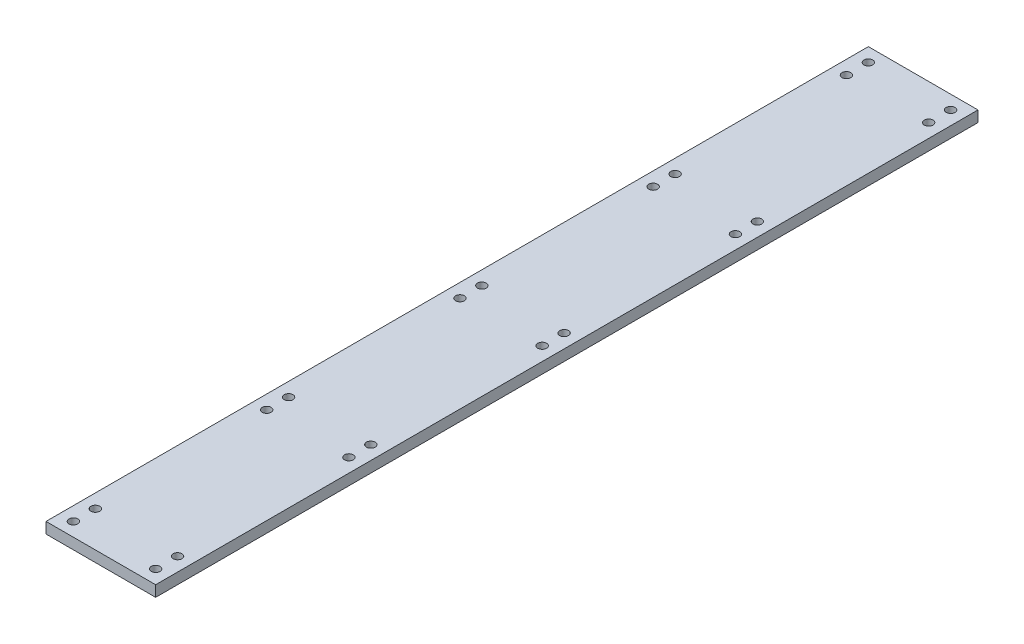
ISO-10303-21;
HEADER;
FILE_DESCRIPTION(('STEP AP214'),'2;1');
FILE_NAME('part.step','',(''),(''),'','','');
FILE_SCHEMA(('AUTOMOTIVE_DESIGN { 1 0 10303 214 1 1 1 1 }'));
ENDSEC;
DATA;
#1=APPLICATION_CONTEXT('core data for automotive mechanical design processes');
#2=APPLICATION_PROTOCOL_DEFINITION('international standard','automotive_design',2000,#1);
#3=PRODUCT_CONTEXT('',#1,'mechanical');
#4=PRODUCT('Part','Part','',(#3));
#5=PRODUCT_RELATED_PRODUCT_CATEGORY('part','',(#4));
#6=PRODUCT_DEFINITION_FORMATION('','',#4);
#7=PRODUCT_DEFINITION_CONTEXT('part definition',#1,'design');
#8=PRODUCT_DEFINITION('design','',#6,#7);
#9=PRODUCT_DEFINITION_SHAPE('','',#8);
#10=(LENGTH_UNIT() NAMED_UNIT(*) SI_UNIT(.MILLI.,.METRE.));
#11=(NAMED_UNIT(*) PLANE_ANGLE_UNIT() SI_UNIT($,.RADIAN.));
#12=(NAMED_UNIT(*) SI_UNIT($,.STERADIAN.) SOLID_ANGLE_UNIT());
#13=UNCERTAINTY_MEASURE_WITH_UNIT(LENGTH_MEASURE(1.E-05),#10,'distance_accuracy_value','');
#14=(GEOMETRIC_REPRESENTATION_CONTEXT(3) GLOBAL_UNCERTAINTY_ASSIGNED_CONTEXT((#13)) GLOBAL_UNIT_ASSIGNED_CONTEXT((#10,
#11,#12)) REPRESENTATION_CONTEXT('',''));
#15=CARTESIAN_POINT('',(0.,0.,0.));
#16=DIRECTION('',(0.,0.,1.));
#17=DIRECTION('',(1.,0.,0.));
#18=AXIS2_PLACEMENT_3D('',#15,#16,#17);
#19=CARTESIAN_POINT('',(0.,4.,0.));
#20=DIRECTION('',(0.,-1.,0.));
#21=DIRECTION('',(0.,0.,-1.));
#22=AXIS2_PLACEMENT_3D('',#19,#20,#21);
#23=PLANE('',#22);
#24=DIRECTION('',(0.,0.,-1.));
#25=VECTOR('',#24,1.);
#26=CARTESIAN_POINT('',(20.,4.,150.));
#27=LINE('',#26,#25);
#28=CARTESIAN_POINT('',(20.,4.,150.));
#29=VERTEX_POINT('',#28);
#30=CARTESIAN_POINT('',(20.,4.,-150.));
#31=VERTEX_POINT('',#30);
#32=EDGE_CURVE('E88',#29,#31,#27,.T.);
#33=ORIENTED_EDGE('',*,*,#32,.T.);
#34=DIRECTION('',(-1.,0.,0.));
#35=VECTOR('',#34,1.);
#36=CARTESIAN_POINT('',(-20.,4.,-150.));
#37=LINE('',#36,#35);
#38=CARTESIAN_POINT('',(-20.,4.,-150.));
#39=VERTEX_POINT('',#38);
#40=EDGE_CURVE('E83',#31,#39,#37,.T.);
#41=ORIENTED_EDGE('',*,*,#40,.T.);
#42=DIRECTION('',(0.,0.,1.));
#43=VECTOR('',#42,1.);
#44=CARTESIAN_POINT('',(-20.,4.,150.));
#45=LINE('',#44,#43);
#46=CARTESIAN_POINT('',(-20.,4.,150.));
#47=VERTEX_POINT('',#46);
#48=EDGE_CURVE('E86',#39,#47,#45,.T.);
#49=ORIENTED_EDGE('',*,*,#48,.T.);
#50=DIRECTION('',(1.,0.,0.));
#51=VECTOR('',#50,1.);
#52=CARTESIAN_POINT('',(-20.,4.,150.));
#53=LINE('',#52,#51);
#54=EDGE_CURVE('E53',#47,#29,#53,.T.);
#55=ORIENTED_EDGE('',*,*,#54,.T.);
#56=EDGE_LOOP('',(#33,#41,#49,#55));
#57=FACE_BOUND('',#56,.T.);
#58=CARTESIAN_POINT('',(-15.,4.,-145.));
#59=DIRECTION('',(0.,1.,0.));
#60=DIRECTION('',(0.,0.,1.));
#61=AXIS2_PLACEMENT_3D('',#58,#59,#60);
#62=CIRCLE('',#61,1.59999999999999);
#63=CARTESIAN_POINT('',(-15.,4.,-143.4));
#64=VERTEX_POINT('',#63);
#65=EDGE_CURVE('E103',#64,#64,#62,.T.);
#66=ORIENTED_EDGE('',*,*,#65,.F.);
#67=EDGE_LOOP('',(#66));
#68=FACE_BOUND('',#67,.T.);
#69=CARTESIAN_POINT('',(-15.,4.,-137.));
#70=DIRECTION('',(0.,1.,0.));
#71=DIRECTION('',(0.,0.,1.));
#72=AXIS2_PLACEMENT_3D('',#69,#70,#71);
#73=CIRCLE('',#72,1.59999999999999);
#74=CARTESIAN_POINT('',(-15.,4.,-135.4));
#75=VERTEX_POINT('',#74);
#76=EDGE_CURVE('E118',#75,#75,#73,.T.);
#77=ORIENTED_EDGE('',*,*,#76,.F.);
#78=EDGE_LOOP('',(#77));
#79=FACE_BOUND('',#78,.T.);
#80=CARTESIAN_POINT('',(15.,4.,-145.));
#81=DIRECTION('',(0.,1.,0.));
#82=DIRECTION('',(0.,0.,1.));
#83=AXIS2_PLACEMENT_3D('',#80,#81,#82);
#84=CIRCLE('',#83,1.59999999999999);
#85=CARTESIAN_POINT('',(15.,4.,-143.4));
#86=VERTEX_POINT('',#85);
#87=EDGE_CURVE('E124',#86,#86,#84,.T.);
#88=ORIENTED_EDGE('',*,*,#87,.F.);
#89=EDGE_LOOP('',(#88));
#90=FACE_BOUND('',#89,.T.);
#91=CARTESIAN_POINT('',(15.,4.,-137.));
#92=DIRECTION('',(0.,1.,0.));
#93=DIRECTION('',(0.,0.,1.));
#94=AXIS2_PLACEMENT_3D('',#91,#92,#93);
#95=CIRCLE('',#94,1.59999999999999);
#96=CARTESIAN_POINT('',(15.,4.,-135.4));
#97=VERTEX_POINT('',#96);
#98=EDGE_CURVE('E130',#97,#97,#95,.T.);
#99=ORIENTED_EDGE('',*,*,#98,.F.);
#100=EDGE_LOOP('',(#99));
#101=FACE_BOUND('',#100,.T.);
#102=CARTESIAN_POINT('',(15.,4.,-74.5));
#103=DIRECTION('',(0.,1.,0.));
#104=DIRECTION('',(0.,0.,1.));
#105=AXIS2_PLACEMENT_3D('',#102,#103,#104);
#106=CIRCLE('',#105,1.60000000000001);
#107=CARTESIAN_POINT('',(15.,4.,-72.9));
#108=VERTEX_POINT('',#107);
#109=EDGE_CURVE('E136',#108,#108,#106,.T.);
#110=ORIENTED_EDGE('',*,*,#109,.F.);
#111=EDGE_LOOP('',(#110));
#112=FACE_BOUND('',#111,.T.);
#113=CARTESIAN_POINT('',(15.,4.,-66.5));
#114=DIRECTION('',(0.,1.,0.));
#115=DIRECTION('',(0.,0.,1.));
#116=AXIS2_PLACEMENT_3D('',#113,#114,#115);
#117=CIRCLE('',#116,1.60000000000001);
#118=CARTESIAN_POINT('',(15.,4.,-64.9));
#119=VERTEX_POINT('',#118);
#120=EDGE_CURVE('E142',#119,#119,#117,.T.);
#121=ORIENTED_EDGE('',*,*,#120,.F.);
#122=EDGE_LOOP('',(#121));
#123=FACE_BOUND('',#122,.T.);
#124=CARTESIAN_POINT('',(15.,4.,-3.99999999999998));
#125=DIRECTION('',(0.,1.,0.));
#126=DIRECTION('',(0.,0.,1.));
#127=AXIS2_PLACEMENT_3D('',#124,#125,#126);
#128=CIRCLE('',#127,1.59999999999999);
#129=CARTESIAN_POINT('',(15.,4.,-2.39999999999998));
#130=VERTEX_POINT('',#129);
#131=EDGE_CURVE('E148',#130,#130,#128,.T.);
#132=ORIENTED_EDGE('',*,*,#131,.F.);
#133=EDGE_LOOP('',(#132));
#134=FACE_BOUND('',#133,.T.);
#135=CARTESIAN_POINT('',(15.,4.,4.00000000000003));
#136=DIRECTION('',(0.,1.,0.));
#137=DIRECTION('',(0.,0.,1.));
#138=AXIS2_PLACEMENT_3D('',#135,#136,#137);
#139=CIRCLE('',#138,1.59999999999999);
#140=CARTESIAN_POINT('',(15.,4.,5.60000000000003));
#141=VERTEX_POINT('',#140);
#142=EDGE_CURVE('E154',#141,#141,#139,.T.);
#143=ORIENTED_EDGE('',*,*,#142,.F.);
#144=EDGE_LOOP('',(#143));
#145=FACE_BOUND('',#144,.T.);
#146=CARTESIAN_POINT('',(15.,4.,66.5));
#147=DIRECTION('',(0.,1.,0.));
#148=DIRECTION('',(0.,0.,1.));
#149=AXIS2_PLACEMENT_3D('',#146,#147,#148);
#150=CIRCLE('',#149,1.60000000000001);
#151=CARTESIAN_POINT('',(15.,4.,68.1000000000001));
#152=VERTEX_POINT('',#151);
#153=EDGE_CURVE('E160',#152,#152,#150,.T.);
#154=ORIENTED_EDGE('',*,*,#153,.F.);
#155=EDGE_LOOP('',(#154));
#156=FACE_BOUND('',#155,.T.);
#157=CARTESIAN_POINT('',(15.,4.,74.5));
#158=DIRECTION('',(0.,1.,0.));
#159=DIRECTION('',(0.,0.,1.));
#160=AXIS2_PLACEMENT_3D('',#157,#158,#159);
#161=CIRCLE('',#160,1.60000000000001);
#162=CARTESIAN_POINT('',(15.,4.,76.1000000000001));
#163=VERTEX_POINT('',#162);
#164=EDGE_CURVE('E166',#163,#163,#161,.T.);
#165=ORIENTED_EDGE('',*,*,#164,.F.);
#166=EDGE_LOOP('',(#165));
#167=FACE_BOUND('',#166,.T.);
#168=CARTESIAN_POINT('',(15.,4.,137.));
#169=DIRECTION('',(0.,1.,0.));
#170=DIRECTION('',(0.,0.,1.));
#171=AXIS2_PLACEMENT_3D('',#168,#169,#170);
#172=CIRCLE('',#171,1.59999999999999);
#173=CARTESIAN_POINT('',(15.,4.,138.6));
#174=VERTEX_POINT('',#173);
#175=EDGE_CURVE('E172',#174,#174,#172,.T.);
#176=ORIENTED_EDGE('',*,*,#175,.F.);
#177=EDGE_LOOP('',(#176));
#178=FACE_BOUND('',#177,.T.);
#179=CARTESIAN_POINT('',(15.,4.,145.));
#180=DIRECTION('',(0.,1.,0.));
#181=DIRECTION('',(0.,0.,1.));
#182=AXIS2_PLACEMENT_3D('',#179,#180,#181);
#183=CIRCLE('',#182,1.59999999999999);
#184=CARTESIAN_POINT('',(15.,4.,146.6));
#185=VERTEX_POINT('',#184);
#186=EDGE_CURVE('E178',#185,#185,#183,.T.);
#187=ORIENTED_EDGE('',*,*,#186,.F.);
#188=EDGE_LOOP('',(#187));
#189=FACE_BOUND('',#188,.T.);
#190=CARTESIAN_POINT('',(-15.,4.,-74.5));
#191=DIRECTION('',(0.,1.,0.));
#192=DIRECTION('',(0.,0.,1.));
#193=AXIS2_PLACEMENT_3D('',#190,#191,#192);
#194=CIRCLE('',#193,1.6);
#195=CARTESIAN_POINT('',(-15.,4.,-72.9));
#196=VERTEX_POINT('',#195);
#197=EDGE_CURVE('E184',#196,#196,#194,.T.);
#198=ORIENTED_EDGE('',*,*,#197,.F.);
#199=EDGE_LOOP('',(#198));
#200=FACE_BOUND('',#199,.T.);
#201=CARTESIAN_POINT('',(-15.,4.,-66.5));
#202=DIRECTION('',(0.,1.,0.));
#203=DIRECTION('',(0.,0.,1.));
#204=AXIS2_PLACEMENT_3D('',#201,#202,#203);
#205=CIRCLE('',#204,1.6);
#206=CARTESIAN_POINT('',(-15.,4.,-64.9));
#207=VERTEX_POINT('',#206);
#208=EDGE_CURVE('E190',#207,#207,#205,.T.);
#209=ORIENTED_EDGE('',*,*,#208,.F.);
#210=EDGE_LOOP('',(#209));
#211=FACE_BOUND('',#210,.T.);
#212=CARTESIAN_POINT('',(-15.,4.,-3.99999999999998));
#213=DIRECTION('',(0.,1.,0.));
#214=DIRECTION('',(0.,0.,1.));
#215=AXIS2_PLACEMENT_3D('',#212,#213,#214);
#216=CIRCLE('',#215,1.6);
#217=CARTESIAN_POINT('',(-15.,4.,-2.39999999999998));
#218=VERTEX_POINT('',#217);
#219=EDGE_CURVE('E196',#218,#218,#216,.T.);
#220=ORIENTED_EDGE('',*,*,#219,.F.);
#221=EDGE_LOOP('',(#220));
#222=FACE_BOUND('',#221,.T.);
#223=CARTESIAN_POINT('',(-15.,4.,4.00000000000003));
#224=DIRECTION('',(0.,1.,0.));
#225=DIRECTION('',(0.,0.,1.));
#226=AXIS2_PLACEMENT_3D('',#223,#224,#225);
#227=CIRCLE('',#226,1.6);
#228=CARTESIAN_POINT('',(-15.,4.,5.60000000000003));
#229=VERTEX_POINT('',#228);
#230=EDGE_CURVE('E202',#229,#229,#227,.T.);
#231=ORIENTED_EDGE('',*,*,#230,.F.);
#232=EDGE_LOOP('',(#231));
#233=FACE_BOUND('',#232,.T.);
#234=CARTESIAN_POINT('',(-15.,4.,66.5));
#235=DIRECTION('',(0.,1.,0.));
#236=DIRECTION('',(0.,0.,1.));
#237=AXIS2_PLACEMENT_3D('',#234,#235,#236);
#238=CIRCLE('',#237,1.6);
#239=CARTESIAN_POINT('',(-15.,4.,68.1));
#240=VERTEX_POINT('',#239);
#241=EDGE_CURVE('E208',#240,#240,#238,.T.);
#242=ORIENTED_EDGE('',*,*,#241,.F.);
#243=EDGE_LOOP('',(#242));
#244=FACE_BOUND('',#243,.T.);
#245=CARTESIAN_POINT('',(-15.,4.,74.5));
#246=DIRECTION('',(0.,1.,0.));
#247=DIRECTION('',(0.,0.,1.));
#248=AXIS2_PLACEMENT_3D('',#245,#246,#247);
#249=CIRCLE('',#248,1.6);
#250=CARTESIAN_POINT('',(-15.,4.,76.1));
#251=VERTEX_POINT('',#250);
#252=EDGE_CURVE('E214',#251,#251,#249,.T.);
#253=ORIENTED_EDGE('',*,*,#252,.F.);
#254=EDGE_LOOP('',(#253));
#255=FACE_BOUND('',#254,.T.);
#256=CARTESIAN_POINT('',(-15.,4.,137.));
#257=DIRECTION('',(0.,1.,0.));
#258=DIRECTION('',(0.,0.,1.));
#259=AXIS2_PLACEMENT_3D('',#256,#257,#258);
#260=CIRCLE('',#259,1.59999999999998);
#261=CARTESIAN_POINT('',(-15.,4.,138.6));
#262=VERTEX_POINT('',#261);
#263=EDGE_CURVE('E220',#262,#262,#260,.T.);
#264=ORIENTED_EDGE('',*,*,#263,.F.);
#265=EDGE_LOOP('',(#264));
#266=FACE_BOUND('',#265,.T.);
#267=CARTESIAN_POINT('',(-15.,4.,145.));
#268=DIRECTION('',(0.,1.,0.));
#269=DIRECTION('',(0.,0.,1.));
#270=AXIS2_PLACEMENT_3D('',#267,#268,#269);
#271=CIRCLE('',#270,1.59999999999998);
#272=CARTESIAN_POINT('',(-15.,4.,146.6));
#273=VERTEX_POINT('',#272);
#274=EDGE_CURVE('E226',#273,#273,#271,.T.);
#275=ORIENTED_EDGE('',*,*,#274,.F.);
#276=EDGE_LOOP('',(#275));
#277=FACE_BOUND('',#276,.T.);
#278=ADVANCED_FACE('F36',(#57,#68,#79,#90,#101,#112,#123,#134,#145,#156,#167,#178,#189,#200,
#211,#222,#233,#244,#255,#266,#277),#23,.F.);
#279=CARTESIAN_POINT('',(0.,0.,0.));
#280=DIRECTION('',(0.,-1.,0.));
#281=DIRECTION('',(0.,0.,-1.));
#282=AXIS2_PLACEMENT_3D('',#279,#280,#281);
#283=PLANE('',#282);
#284=CARTESIAN_POINT('',(-15.,0.,137.));
#285=DIRECTION('',(0.,1.,0.));
#286=DIRECTION('',(0.,0.,1.));
#287=AXIS2_PLACEMENT_3D('',#284,#285,#286);
#288=CIRCLE('',#287,1.59999999999998);
#289=CARTESIAN_POINT('',(-15.,0.,138.6));
#290=VERTEX_POINT('',#289);
#291=EDGE_CURVE('E223',#290,#290,#288,.T.);
#292=ORIENTED_EDGE('',*,*,#291,.T.);
#293=EDGE_LOOP('',(#292));
#294=FACE_BOUND('',#293,.T.);
#295=CARTESIAN_POINT('',(-15.,0.,66.5));
#296=DIRECTION('',(0.,1.,0.));
#297=DIRECTION('',(0.,0.,1.));
#298=AXIS2_PLACEMENT_3D('',#295,#296,#297);
#299=CIRCLE('',#298,1.6);
#300=CARTESIAN_POINT('',(-15.,0.,68.1));
#301=VERTEX_POINT('',#300);
#302=EDGE_CURVE('E211',#301,#301,#299,.T.);
#303=ORIENTED_EDGE('',*,*,#302,.T.);
#304=EDGE_LOOP('',(#303));
#305=FACE_BOUND('',#304,.T.);
#306=CARTESIAN_POINT('',(-15.,0.,-3.99999999999998));
#307=DIRECTION('',(0.,1.,0.));
#308=DIRECTION('',(0.,0.,1.));
#309=AXIS2_PLACEMENT_3D('',#306,#307,#308);
#310=CIRCLE('',#309,1.6);
#311=CARTESIAN_POINT('',(-15.,0.,-2.39999999999998));
#312=VERTEX_POINT('',#311);
#313=EDGE_CURVE('E199',#312,#312,#310,.T.);
#314=ORIENTED_EDGE('',*,*,#313,.T.);
#315=EDGE_LOOP('',(#314));
#316=FACE_BOUND('',#315,.T.);
#317=CARTESIAN_POINT('',(-15.,0.,-74.5));
#318=DIRECTION('',(0.,1.,0.));
#319=DIRECTION('',(0.,0.,1.));
#320=AXIS2_PLACEMENT_3D('',#317,#318,#319);
#321=CIRCLE('',#320,1.6);
#322=CARTESIAN_POINT('',(-15.,0.,-72.9));
#323=VERTEX_POINT('',#322);
#324=EDGE_CURVE('E187',#323,#323,#321,.T.);
#325=ORIENTED_EDGE('',*,*,#324,.T.);
#326=EDGE_LOOP('',(#325));
#327=FACE_BOUND('',#326,.T.);
#328=CARTESIAN_POINT('',(15.,0.,137.));
#329=DIRECTION('',(0.,1.,0.));
#330=DIRECTION('',(0.,0.,1.));
#331=AXIS2_PLACEMENT_3D('',#328,#329,#330);
#332=CIRCLE('',#331,1.59999999999999);
#333=CARTESIAN_POINT('',(15.,0.,138.6));
#334=VERTEX_POINT('',#333);
#335=EDGE_CURVE('E175',#334,#334,#332,.T.);
#336=ORIENTED_EDGE('',*,*,#335,.T.);
#337=EDGE_LOOP('',(#336));
#338=FACE_BOUND('',#337,.T.);
#339=CARTESIAN_POINT('',(15.,0.,66.5));
#340=DIRECTION('',(0.,1.,0.));
#341=DIRECTION('',(0.,0.,1.));
#342=AXIS2_PLACEMENT_3D('',#339,#340,#341);
#343=CIRCLE('',#342,1.60000000000001);
#344=CARTESIAN_POINT('',(15.,0.,68.1000000000001));
#345=VERTEX_POINT('',#344);
#346=EDGE_CURVE('E163',#345,#345,#343,.T.);
#347=ORIENTED_EDGE('',*,*,#346,.T.);
#348=EDGE_LOOP('',(#347));
#349=FACE_BOUND('',#348,.T.);
#350=CARTESIAN_POINT('',(15.,0.,-3.99999999999998));
#351=DIRECTION('',(0.,1.,0.));
#352=DIRECTION('',(0.,0.,1.));
#353=AXIS2_PLACEMENT_3D('',#350,#351,#352);
#354=CIRCLE('',#353,1.59999999999999);
#355=CARTESIAN_POINT('',(15.,0.,-2.39999999999998));
#356=VERTEX_POINT('',#355);
#357=EDGE_CURVE('E151',#356,#356,#354,.T.);
#358=ORIENTED_EDGE('',*,*,#357,.T.);
#359=EDGE_LOOP('',(#358));
#360=FACE_BOUND('',#359,.T.);
#361=CARTESIAN_POINT('',(15.,0.,-74.5));
#362=DIRECTION('',(0.,1.,0.));
#363=DIRECTION('',(0.,0.,1.));
#364=AXIS2_PLACEMENT_3D('',#361,#362,#363);
#365=CIRCLE('',#364,1.60000000000001);
#366=CARTESIAN_POINT('',(15.,0.,-72.9));
#367=VERTEX_POINT('',#366);
#368=EDGE_CURVE('E139',#367,#367,#365,.T.);
#369=ORIENTED_EDGE('',*,*,#368,.T.);
#370=EDGE_LOOP('',(#369));
#371=FACE_BOUND('',#370,.T.);
#372=CARTESIAN_POINT('',(15.,0.,-145.));
#373=DIRECTION('',(0.,1.,0.));
#374=DIRECTION('',(0.,0.,1.));
#375=AXIS2_PLACEMENT_3D('',#372,#373,#374);
#376=CIRCLE('',#375,1.59999999999999);
#377=CARTESIAN_POINT('',(15.,0.,-143.4));
#378=VERTEX_POINT('',#377);
#379=EDGE_CURVE('E127',#378,#378,#376,.T.);
#380=ORIENTED_EDGE('',*,*,#379,.T.);
#381=EDGE_LOOP('',(#380));
#382=FACE_BOUND('',#381,.T.);
#383=CARTESIAN_POINT('',(-15.,0.,-145.));
#384=DIRECTION('',(0.,1.,0.));
#385=DIRECTION('',(0.,0.,1.));
#386=AXIS2_PLACEMENT_3D('',#383,#384,#385);
#387=CIRCLE('',#386,1.59999999999999);
#388=CARTESIAN_POINT('',(-15.,0.,-143.4));
#389=VERTEX_POINT('',#388);
#390=EDGE_CURVE('E115',#389,#389,#387,.T.);
#391=ORIENTED_EDGE('',*,*,#390,.T.);
#392=EDGE_LOOP('',(#391));
#393=FACE_BOUND('',#392,.T.);
#394=DIRECTION('',(0.,0.,-1.));
#395=VECTOR('',#394,1.);
#396=CARTESIAN_POINT('',(20.,0.,150.));
#397=LINE('',#396,#395);
#398=CARTESIAN_POINT('',(20.,0.,150.));
#399=VERTEX_POINT('',#398);
#400=CARTESIAN_POINT('',(20.,0.,-150.));
#401=VERTEX_POINT('',#400);
#402=EDGE_CURVE('E100',#399,#401,#397,.T.);
#403=ORIENTED_EDGE('',*,*,#402,.F.);
#404=DIRECTION('',(1.,0.,0.));
#405=VECTOR('',#404,1.);
#406=CARTESIAN_POINT('',(-20.,0.,150.));
#407=LINE('',#406,#405);
#408=CARTESIAN_POINT('',(-20.,0.,150.));
#409=VERTEX_POINT('',#408);
#410=EDGE_CURVE('E76',#409,#399,#407,.T.);
#411=ORIENTED_EDGE('',*,*,#410,.F.);
#412=DIRECTION('',(0.,0.,1.));
#413=VECTOR('',#412,1.);
#414=CARTESIAN_POINT('',(-20.,0.,150.));
#415=LINE('',#414,#413);
#416=CARTESIAN_POINT('',(-20.,0.,-150.));
#417=VERTEX_POINT('',#416);
#418=EDGE_CURVE('E70',#417,#409,#415,.T.);
#419=ORIENTED_EDGE('',*,*,#418,.F.);
#420=DIRECTION('',(-1.,0.,0.));
#421=VECTOR('',#420,1.);
#422=CARTESIAN_POINT('',(-20.,0.,-150.));
#423=LINE('',#422,#421);
#424=EDGE_CURVE('E92',#401,#417,#423,.T.);
#425=ORIENTED_EDGE('',*,*,#424,.F.);
#426=EDGE_LOOP('',(#403,#411,#419,#425));
#427=FACE_BOUND('',#426,.T.);
#428=CARTESIAN_POINT('',(-15.,0.,-137.));
#429=DIRECTION('',(0.,1.,0.));
#430=DIRECTION('',(0.,0.,1.));
#431=AXIS2_PLACEMENT_3D('',#428,#429,#430);
#432=CIRCLE('',#431,1.59999999999999);
#433=CARTESIAN_POINT('',(-15.,0.,-135.4));
#434=VERTEX_POINT('',#433);
#435=EDGE_CURVE('E121',#434,#434,#432,.T.);
#436=ORIENTED_EDGE('',*,*,#435,.T.);
#437=EDGE_LOOP('',(#436));
#438=FACE_BOUND('',#437,.T.);
#439=CARTESIAN_POINT('',(15.,0.,-137.));
#440=DIRECTION('',(0.,1.,0.));
#441=DIRECTION('',(0.,0.,1.));
#442=AXIS2_PLACEMENT_3D('',#439,#440,#441);
#443=CIRCLE('',#442,1.59999999999999);
#444=CARTESIAN_POINT('',(15.,0.,-135.4));
#445=VERTEX_POINT('',#444);
#446=EDGE_CURVE('E133',#445,#445,#443,.T.);
#447=ORIENTED_EDGE('',*,*,#446,.T.);
#448=EDGE_LOOP('',(#447));
#449=FACE_BOUND('',#448,.T.);
#450=CARTESIAN_POINT('',(15.,0.,-66.5));
#451=DIRECTION('',(0.,1.,0.));
#452=DIRECTION('',(0.,0.,1.));
#453=AXIS2_PLACEMENT_3D('',#450,#451,#452);
#454=CIRCLE('',#453,1.60000000000001);
#455=CARTESIAN_POINT('',(15.,0.,-64.9));
#456=VERTEX_POINT('',#455);
#457=EDGE_CURVE('E145',#456,#456,#454,.T.);
#458=ORIENTED_EDGE('',*,*,#457,.T.);
#459=EDGE_LOOP('',(#458));
#460=FACE_BOUND('',#459,.T.);
#461=CARTESIAN_POINT('',(15.,0.,4.00000000000003));
#462=DIRECTION('',(0.,1.,0.));
#463=DIRECTION('',(0.,0.,1.));
#464=AXIS2_PLACEMENT_3D('',#461,#462,#463);
#465=CIRCLE('',#464,1.59999999999999);
#466=CARTESIAN_POINT('',(15.,0.,5.60000000000003));
#467=VERTEX_POINT('',#466);
#468=EDGE_CURVE('E157',#467,#467,#465,.T.);
#469=ORIENTED_EDGE('',*,*,#468,.T.);
#470=EDGE_LOOP('',(#469));
#471=FACE_BOUND('',#470,.T.);
#472=CARTESIAN_POINT('',(15.,0.,74.5));
#473=DIRECTION('',(0.,1.,0.));
#474=DIRECTION('',(0.,0.,1.));
#475=AXIS2_PLACEMENT_3D('',#472,#473,#474);
#476=CIRCLE('',#475,1.60000000000001);
#477=CARTESIAN_POINT('',(15.,0.,76.1000000000001));
#478=VERTEX_POINT('',#477);
#479=EDGE_CURVE('E169',#478,#478,#476,.T.);
#480=ORIENTED_EDGE('',*,*,#479,.T.);
#481=EDGE_LOOP('',(#480));
#482=FACE_BOUND('',#481,.T.);
#483=CARTESIAN_POINT('',(15.,0.,145.));
#484=DIRECTION('',(0.,1.,0.));
#485=DIRECTION('',(0.,0.,1.));
#486=AXIS2_PLACEMENT_3D('',#483,#484,#485);
#487=CIRCLE('',#486,1.59999999999999);
#488=CARTESIAN_POINT('',(15.,0.,146.6));
#489=VERTEX_POINT('',#488);
#490=EDGE_CURVE('E181',#489,#489,#487,.T.);
#491=ORIENTED_EDGE('',*,*,#490,.T.);
#492=EDGE_LOOP('',(#491));
#493=FACE_BOUND('',#492,.T.);
#494=CARTESIAN_POINT('',(-15.,0.,-66.5));
#495=DIRECTION('',(0.,1.,0.));
#496=DIRECTION('',(0.,0.,1.));
#497=AXIS2_PLACEMENT_3D('',#494,#495,#496);
#498=CIRCLE('',#497,1.6);
#499=CARTESIAN_POINT('',(-15.,0.,-64.9));
#500=VERTEX_POINT('',#499);
#501=EDGE_CURVE('E193',#500,#500,#498,.T.);
#502=ORIENTED_EDGE('',*,*,#501,.T.);
#503=EDGE_LOOP('',(#502));
#504=FACE_BOUND('',#503,.T.);
#505=CARTESIAN_POINT('',(-15.,0.,4.00000000000003));
#506=DIRECTION('',(0.,1.,0.));
#507=DIRECTION('',(0.,0.,1.));
#508=AXIS2_PLACEMENT_3D('',#505,#506,#507);
#509=CIRCLE('',#508,1.6);
#510=CARTESIAN_POINT('',(-15.,0.,5.60000000000003));
#511=VERTEX_POINT('',#510);
#512=EDGE_CURVE('E205',#511,#511,#509,.T.);
#513=ORIENTED_EDGE('',*,*,#512,.T.);
#514=EDGE_LOOP('',(#513));
#515=FACE_BOUND('',#514,.T.);
#516=CARTESIAN_POINT('',(-15.,0.,74.5));
#517=DIRECTION('',(0.,1.,0.));
#518=DIRECTION('',(0.,0.,1.));
#519=AXIS2_PLACEMENT_3D('',#516,#517,#518);
#520=CIRCLE('',#519,1.6);
#521=CARTESIAN_POINT('',(-15.,0.,76.1));
#522=VERTEX_POINT('',#521);
#523=EDGE_CURVE('E217',#522,#522,#520,.T.);
#524=ORIENTED_EDGE('',*,*,#523,.T.);
#525=EDGE_LOOP('',(#524));
#526=FACE_BOUND('',#525,.T.);
#527=CARTESIAN_POINT('',(-15.,0.,145.));
#528=DIRECTION('',(0.,1.,0.));
#529=DIRECTION('',(0.,0.,1.));
#530=AXIS2_PLACEMENT_3D('',#527,#528,#529);
#531=CIRCLE('',#530,1.59999999999998);
#532=CARTESIAN_POINT('',(-15.,0.,146.6));
#533=VERTEX_POINT('',#532);
#534=EDGE_CURVE('E229',#533,#533,#531,.T.);
#535=ORIENTED_EDGE('',*,*,#534,.T.);
#536=EDGE_LOOP('',(#535));
#537=FACE_BOUND('',#536,.T.);
#538=ADVANCED_FACE('F111',(#294,#305,#316,#327,#338,#349,#360,#371,#382,#393,#427,#438,#449,
#460,#471,#482,#493,#504,#515,#526,#537),#283,.T.);
#539=CARTESIAN_POINT('',(20.,4.,150.));
#540=DIRECTION('',(-1.,0.,0.));
#541=DIRECTION('',(0.,0.,1.));
#542=AXIS2_PLACEMENT_3D('',#539,#540,#541);
#543=PLANE('',#542);
#544=ORIENTED_EDGE('',*,*,#402,.T.);
#545=DIRECTION('',(0.,-1.,0.));
#546=VECTOR('',#545,1.);
#547=CARTESIAN_POINT('',(20.,4.,-150.));
#548=LINE('',#547,#546);
#549=EDGE_CURVE('E11',#31,#401,#548,.T.);
#550=ORIENTED_EDGE('',*,*,#549,.F.);
#551=ORIENTED_EDGE('',*,*,#32,.F.);
#552=DIRECTION('',(0.,-1.,0.));
#553=VECTOR('',#552,1.);
#554=CARTESIAN_POINT('',(20.,4.,150.));
#555=LINE('',#554,#553);
#556=EDGE_CURVE('E96',#29,#399,#555,.T.);
#557=ORIENTED_EDGE('',*,*,#556,.T.);
#558=EDGE_LOOP('',(#544,#550,#551,#557));
#559=FACE_BOUND('',#558,.T.);
#560=ADVANCED_FACE('F38',(#559),#543,.F.);
#561=CARTESIAN_POINT('',(-20.,4.,-150.));
#562=DIRECTION('',(0.,0.,1.));
#563=DIRECTION('',(1.,0.,0.));
#564=AXIS2_PLACEMENT_3D('',#561,#562,#563);
#565=PLANE('',#564);
#566=ORIENTED_EDGE('',*,*,#424,.T.);
#567=DIRECTION('',(0.,-1.,0.));
#568=VECTOR('',#567,1.);
#569=CARTESIAN_POINT('',(-20.,4.,-150.));
#570=LINE('',#569,#568);
#571=EDGE_CURVE('E45',#39,#417,#570,.T.);
#572=ORIENTED_EDGE('',*,*,#571,.F.);
#573=ORIENTED_EDGE('',*,*,#40,.F.);
#574=ORIENTED_EDGE('',*,*,#549,.T.);
#575=EDGE_LOOP('',(#566,#572,#573,#574));
#576=FACE_BOUND('',#575,.T.);
#577=ADVANCED_FACE('F91',(#576),#565,.F.);
#578=CARTESIAN_POINT('',(-20.,4.,150.));
#579=DIRECTION('',(1.,0.,0.));
#580=DIRECTION('',(0.,0.,-1.));
#581=AXIS2_PLACEMENT_3D('',#578,#579,#580);
#582=PLANE('',#581);
#583=ORIENTED_EDGE('',*,*,#418,.T.);
#584=DIRECTION('',(0.,-1.,0.));
#585=VECTOR('',#584,1.);
#586=CARTESIAN_POINT('',(-20.,4.,150.));
#587=LINE('',#586,#585);
#588=EDGE_CURVE('E93',#47,#409,#587,.T.);
#589=ORIENTED_EDGE('',*,*,#588,.F.);
#590=ORIENTED_EDGE('',*,*,#48,.F.);
#591=ORIENTED_EDGE('',*,*,#571,.T.);
#592=EDGE_LOOP('',(#583,#589,#590,#591));
#593=FACE_BOUND('',#592,.T.);
#594=ADVANCED_FACE('F94',(#593),#582,.F.);
#595=CARTESIAN_POINT('',(-20.,4.,150.));
#596=DIRECTION('',(0.,0.,-1.));
#597=DIRECTION('',(-1.,0.,0.));
#598=AXIS2_PLACEMENT_3D('',#595,#596,#597);
#599=PLANE('',#598);
#600=ORIENTED_EDGE('',*,*,#410,.T.);
#601=ORIENTED_EDGE('',*,*,#556,.F.);
#602=ORIENTED_EDGE('',*,*,#54,.F.);
#603=ORIENTED_EDGE('',*,*,#588,.T.);
#604=EDGE_LOOP('',(#600,#601,#602,#603));
#605=FACE_BOUND('',#604,.T.);
#606=ADVANCED_FACE('F108',(#605),#599,.F.);
#607=CARTESIAN_POINT('',(-15.,4.,-145.));
#608=DIRECTION('',(0.,-1.,0.));
#609=DIRECTION('',(0.,0.,-1.));
#610=AXIS2_PLACEMENT_3D('',#607,#608,#609);
#611=CYLINDRICAL_SURFACE('',#610,1.59999999999999);
#612=ORIENTED_EDGE('',*,*,#65,.T.);
#613=EDGE_LOOP('',(#612));
#614=FACE_BOUND('',#613,.T.);
#615=ORIENTED_EDGE('',*,*,#390,.F.);
#616=EDGE_LOOP('',(#615));
#617=FACE_BOUND('',#616,.T.);
#618=ADVANCED_FACE('F246',(#614,#617),#611,.F.);
#619=CARTESIAN_POINT('',(-15.,4.,-137.));
#620=DIRECTION('',(0.,-1.,0.));
#621=DIRECTION('',(0.,0.,-1.));
#622=AXIS2_PLACEMENT_3D('',#619,#620,#621);
#623=CYLINDRICAL_SURFACE('',#622,1.59999999999999);
#624=ORIENTED_EDGE('',*,*,#76,.T.);
#625=EDGE_LOOP('',(#624));
#626=FACE_BOUND('',#625,.T.);
#627=ORIENTED_EDGE('',*,*,#435,.F.);
#628=EDGE_LOOP('',(#627));
#629=FACE_BOUND('',#628,.T.);
#630=ADVANCED_FACE('F292',(#626,#629),#623,.F.);
#631=CARTESIAN_POINT('',(15.,4.,-145.));
#632=DIRECTION('',(0.,-1.,0.));
#633=DIRECTION('',(0.,0.,-1.));
#634=AXIS2_PLACEMENT_3D('',#631,#632,#633);
#635=CYLINDRICAL_SURFACE('',#634,1.59999999999999);
#636=ORIENTED_EDGE('',*,*,#87,.T.);
#637=EDGE_LOOP('',(#636));
#638=FACE_BOUND('',#637,.T.);
#639=ORIENTED_EDGE('',*,*,#379,.F.);
#640=EDGE_LOOP('',(#639));
#641=FACE_BOUND('',#640,.T.);
#642=ADVANCED_FACE('F300',(#638,#641),#635,.F.);
#643=CARTESIAN_POINT('',(15.,4.,-137.));
#644=DIRECTION('',(0.,-1.,0.));
#645=DIRECTION('',(0.,0.,-1.));
#646=AXIS2_PLACEMENT_3D('',#643,#644,#645);
#647=CYLINDRICAL_SURFACE('',#646,1.59999999999999);
#648=ORIENTED_EDGE('',*,*,#98,.T.);
#649=EDGE_LOOP('',(#648));
#650=FACE_BOUND('',#649,.T.);
#651=ORIENTED_EDGE('',*,*,#446,.F.);
#652=EDGE_LOOP('',(#651));
#653=FACE_BOUND('',#652,.T.);
#654=ADVANCED_FACE('F308',(#650,#653),#647,.F.);
#655=CARTESIAN_POINT('',(15.,4.,-74.5));
#656=DIRECTION('',(0.,-1.,0.));
#657=DIRECTION('',(0.,0.,-1.));
#658=AXIS2_PLACEMENT_3D('',#655,#656,#657);
#659=CYLINDRICAL_SURFACE('',#658,1.60000000000001);
#660=ORIENTED_EDGE('',*,*,#109,.T.);
#661=EDGE_LOOP('',(#660));
#662=FACE_BOUND('',#661,.T.);
#663=ORIENTED_EDGE('',*,*,#368,.F.);
#664=EDGE_LOOP('',(#663));
#665=FACE_BOUND('',#664,.T.);
#666=ADVANCED_FACE('F317',(#662,#665),#659,.F.);
#667=CARTESIAN_POINT('',(15.,4.,-66.5));
#668=DIRECTION('',(0.,-1.,0.));
#669=DIRECTION('',(0.,0.,-1.));
#670=AXIS2_PLACEMENT_3D('',#667,#668,#669);
#671=CYLINDRICAL_SURFACE('',#670,1.60000000000001);
#672=ORIENTED_EDGE('',*,*,#120,.T.);
#673=EDGE_LOOP('',(#672));
#674=FACE_BOUND('',#673,.T.);
#675=ORIENTED_EDGE('',*,*,#457,.F.);
#676=EDGE_LOOP('',(#675));
#677=FACE_BOUND('',#676,.T.);
#678=ADVANCED_FACE('F326',(#674,#677),#671,.F.);
#679=CARTESIAN_POINT('',(15.,4.,-3.99999999999998));
#680=DIRECTION('',(0.,-1.,0.));
#681=DIRECTION('',(0.,0.,-1.));
#682=AXIS2_PLACEMENT_3D('',#679,#680,#681);
#683=CYLINDRICAL_SURFACE('',#682,1.59999999999999);
#684=ORIENTED_EDGE('',*,*,#131,.T.);
#685=EDGE_LOOP('',(#684));
#686=FACE_BOUND('',#685,.T.);
#687=ORIENTED_EDGE('',*,*,#357,.F.);
#688=EDGE_LOOP('',(#687));
#689=FACE_BOUND('',#688,.T.);
#690=ADVANCED_FACE('F335',(#686,#689),#683,.F.);
#691=CARTESIAN_POINT('',(15.,4.,4.00000000000003));
#692=DIRECTION('',(0.,-1.,0.));
#693=DIRECTION('',(0.,0.,-1.));
#694=AXIS2_PLACEMENT_3D('',#691,#692,#693);
#695=CYLINDRICAL_SURFACE('',#694,1.59999999999999);
#696=ORIENTED_EDGE('',*,*,#142,.T.);
#697=EDGE_LOOP('',(#696));
#698=FACE_BOUND('',#697,.T.);
#699=ORIENTED_EDGE('',*,*,#468,.F.);
#700=EDGE_LOOP('',(#699));
#701=FACE_BOUND('',#700,.T.);
#702=ADVANCED_FACE('F344',(#698,#701),#695,.F.);
#703=CARTESIAN_POINT('',(15.,4.,66.5));
#704=DIRECTION('',(0.,-1.,0.));
#705=DIRECTION('',(0.,0.,-1.));
#706=AXIS2_PLACEMENT_3D('',#703,#704,#705);
#707=CYLINDRICAL_SURFACE('',#706,1.60000000000001);
#708=ORIENTED_EDGE('',*,*,#153,.T.);
#709=EDGE_LOOP('',(#708));
#710=FACE_BOUND('',#709,.T.);
#711=ORIENTED_EDGE('',*,*,#346,.F.);
#712=EDGE_LOOP('',(#711));
#713=FACE_BOUND('',#712,.T.);
#714=ADVANCED_FACE('F353',(#710,#713),#707,.F.);
#715=CARTESIAN_POINT('',(15.,4.,74.5));
#716=DIRECTION('',(0.,-1.,0.));
#717=DIRECTION('',(0.,0.,-1.));
#718=AXIS2_PLACEMENT_3D('',#715,#716,#717);
#719=CYLINDRICAL_SURFACE('',#718,1.60000000000001);
#720=ORIENTED_EDGE('',*,*,#164,.T.);
#721=EDGE_LOOP('',(#720));
#722=FACE_BOUND('',#721,.T.);
#723=ORIENTED_EDGE('',*,*,#479,.F.);
#724=EDGE_LOOP('',(#723));
#725=FACE_BOUND('',#724,.T.);
#726=ADVANCED_FACE('F362',(#722,#725),#719,.F.);
#727=CARTESIAN_POINT('',(15.,4.,137.));
#728=DIRECTION('',(0.,-1.,0.));
#729=DIRECTION('',(0.,0.,-1.));
#730=AXIS2_PLACEMENT_3D('',#727,#728,#729);
#731=CYLINDRICAL_SURFACE('',#730,1.59999999999999);
#732=ORIENTED_EDGE('',*,*,#175,.T.);
#733=EDGE_LOOP('',(#732));
#734=FACE_BOUND('',#733,.T.);
#735=ORIENTED_EDGE('',*,*,#335,.F.);
#736=EDGE_LOOP('',(#735));
#737=FACE_BOUND('',#736,.T.);
#738=ADVANCED_FACE('F371',(#734,#737),#731,.F.);
#739=CARTESIAN_POINT('',(15.,4.,145.));
#740=DIRECTION('',(0.,-1.,0.));
#741=DIRECTION('',(0.,0.,-1.));
#742=AXIS2_PLACEMENT_3D('',#739,#740,#741);
#743=CYLINDRICAL_SURFACE('',#742,1.59999999999999);
#744=ORIENTED_EDGE('',*,*,#186,.T.);
#745=EDGE_LOOP('',(#744));
#746=FACE_BOUND('',#745,.T.);
#747=ORIENTED_EDGE('',*,*,#490,.F.);
#748=EDGE_LOOP('',(#747));
#749=FACE_BOUND('',#748,.T.);
#750=ADVANCED_FACE('F380',(#746,#749),#743,.F.);
#751=CARTESIAN_POINT('',(-15.,4.,-74.5));
#752=DIRECTION('',(0.,-1.,0.));
#753=DIRECTION('',(0.,0.,-1.));
#754=AXIS2_PLACEMENT_3D('',#751,#752,#753);
#755=CYLINDRICAL_SURFACE('',#754,1.6);
#756=ORIENTED_EDGE('',*,*,#197,.T.);
#757=EDGE_LOOP('',(#756));
#758=FACE_BOUND('',#757,.T.);
#759=ORIENTED_EDGE('',*,*,#324,.F.);
#760=EDGE_LOOP('',(#759));
#761=FACE_BOUND('',#760,.T.);
#762=ADVANCED_FACE('F389',(#758,#761),#755,.F.);
#763=CARTESIAN_POINT('',(-15.,4.,-66.5));
#764=DIRECTION('',(0.,-1.,0.));
#765=DIRECTION('',(0.,0.,-1.));
#766=AXIS2_PLACEMENT_3D('',#763,#764,#765);
#767=CYLINDRICAL_SURFACE('',#766,1.6);
#768=ORIENTED_EDGE('',*,*,#208,.T.);
#769=EDGE_LOOP('',(#768));
#770=FACE_BOUND('',#769,.T.);
#771=ORIENTED_EDGE('',*,*,#501,.F.);
#772=EDGE_LOOP('',(#771));
#773=FACE_BOUND('',#772,.T.);
#774=ADVANCED_FACE('F398',(#770,#773),#767,.F.);
#775=CARTESIAN_POINT('',(-15.,4.,-3.99999999999998));
#776=DIRECTION('',(0.,-1.,0.));
#777=DIRECTION('',(0.,0.,-1.));
#778=AXIS2_PLACEMENT_3D('',#775,#776,#777);
#779=CYLINDRICAL_SURFACE('',#778,1.6);
#780=ORIENTED_EDGE('',*,*,#219,.T.);
#781=EDGE_LOOP('',(#780));
#782=FACE_BOUND('',#781,.T.);
#783=ORIENTED_EDGE('',*,*,#313,.F.);
#784=EDGE_LOOP('',(#783));
#785=FACE_BOUND('',#784,.T.);
#786=ADVANCED_FACE('F407',(#782,#785),#779,.F.);
#787=CARTESIAN_POINT('',(-15.,4.,4.00000000000003));
#788=DIRECTION('',(0.,-1.,0.));
#789=DIRECTION('',(0.,0.,-1.));
#790=AXIS2_PLACEMENT_3D('',#787,#788,#789);
#791=CYLINDRICAL_SURFACE('',#790,1.6);
#792=ORIENTED_EDGE('',*,*,#230,.T.);
#793=EDGE_LOOP('',(#792));
#794=FACE_BOUND('',#793,.T.);
#795=ORIENTED_EDGE('',*,*,#512,.F.);
#796=EDGE_LOOP('',(#795));
#797=FACE_BOUND('',#796,.T.);
#798=ADVANCED_FACE('F416',(#794,#797),#791,.F.);
#799=CARTESIAN_POINT('',(-15.,4.,66.5));
#800=DIRECTION('',(0.,-1.,0.));
#801=DIRECTION('',(0.,0.,-1.));
#802=AXIS2_PLACEMENT_3D('',#799,#800,#801);
#803=CYLINDRICAL_SURFACE('',#802,1.6);
#804=ORIENTED_EDGE('',*,*,#241,.T.);
#805=EDGE_LOOP('',(#804));
#806=FACE_BOUND('',#805,.T.);
#807=ORIENTED_EDGE('',*,*,#302,.F.);
#808=EDGE_LOOP('',(#807));
#809=FACE_BOUND('',#808,.T.);
#810=ADVANCED_FACE('F425',(#806,#809),#803,.F.);
#811=CARTESIAN_POINT('',(-15.,4.,74.5));
#812=DIRECTION('',(0.,-1.,0.));
#813=DIRECTION('',(0.,0.,-1.));
#814=AXIS2_PLACEMENT_3D('',#811,#812,#813);
#815=CYLINDRICAL_SURFACE('',#814,1.6);
#816=ORIENTED_EDGE('',*,*,#252,.T.);
#817=EDGE_LOOP('',(#816));
#818=FACE_BOUND('',#817,.T.);
#819=ORIENTED_EDGE('',*,*,#523,.F.);
#820=EDGE_LOOP('',(#819));
#821=FACE_BOUND('',#820,.T.);
#822=ADVANCED_FACE('F434',(#818,#821),#815,.F.);
#823=CARTESIAN_POINT('',(-15.,4.,137.));
#824=DIRECTION('',(0.,-1.,0.));
#825=DIRECTION('',(0.,0.,-1.));
#826=AXIS2_PLACEMENT_3D('',#823,#824,#825);
#827=CYLINDRICAL_SURFACE('',#826,1.59999999999998);
#828=ORIENTED_EDGE('',*,*,#263,.T.);
#829=EDGE_LOOP('',(#828));
#830=FACE_BOUND('',#829,.T.);
#831=ORIENTED_EDGE('',*,*,#291,.F.);
#832=EDGE_LOOP('',(#831));
#833=FACE_BOUND('',#832,.T.);
#834=ADVANCED_FACE('F443',(#830,#833),#827,.F.);
#835=CARTESIAN_POINT('',(-15.,4.,145.));
#836=DIRECTION('',(0.,-1.,0.));
#837=DIRECTION('',(0.,0.,-1.));
#838=AXIS2_PLACEMENT_3D('',#835,#836,#837);
#839=CYLINDRICAL_SURFACE('',#838,1.59999999999998);
#840=ORIENTED_EDGE('',*,*,#274,.T.);
#841=EDGE_LOOP('',(#840));
#842=FACE_BOUND('',#841,.T.);
#843=ORIENTED_EDGE('',*,*,#534,.F.);
#844=EDGE_LOOP('',(#843));
#845=FACE_BOUND('',#844,.T.);
#846=ADVANCED_FACE('F235',(#842,#845),#839,.F.);
#847=CLOSED_SHELL('',(#278,#538,#560,#577,#594,#606,#618,#630,#642,#654,#666,#678,#690,#702,
#714,#726,#738,#750,#762,#774,#786,#798,#810,#822,#834,#846));
#848=MANIFOLD_SOLID_BREP('B2',#847);
#849=ADVANCED_BREP_SHAPE_REPRESENTATION('',(#18,#848),#14);
#850=SHAPE_DEFINITION_REPRESENTATION(#9,#849);
ENDSEC;
END-ISO-10303-21;
